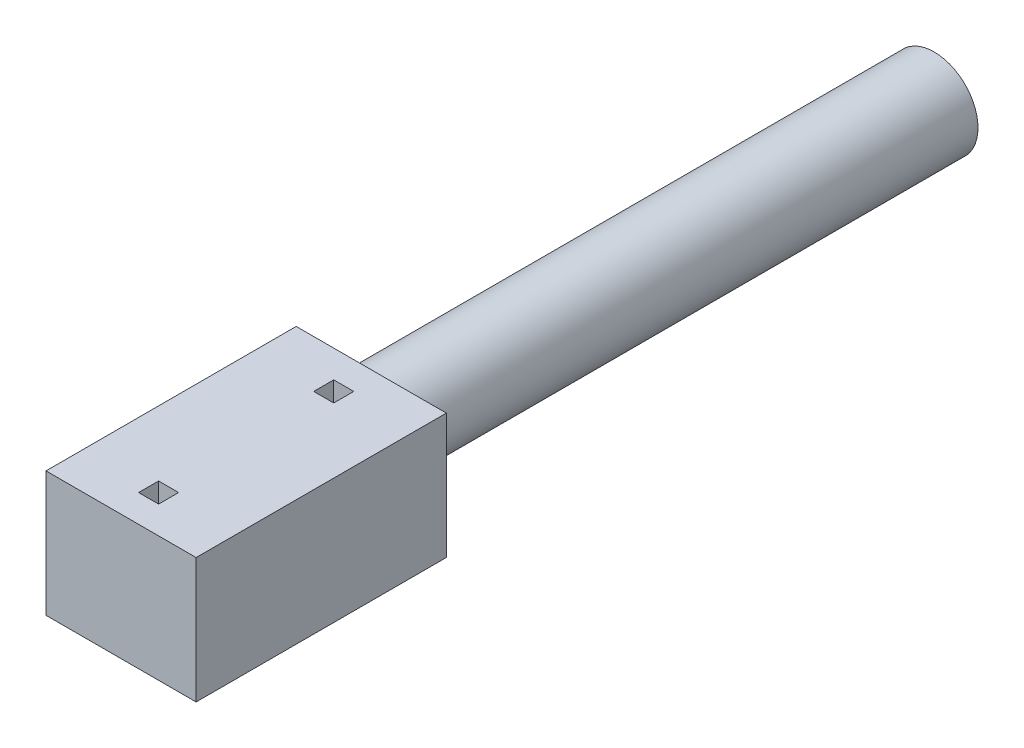
ISO-10303-21;
HEADER;
FILE_DESCRIPTION(('STEP AP214'),'2;1');
FILE_NAME('part.step','',(''),(''),'','','');
FILE_SCHEMA(('AUTOMOTIVE_DESIGN { 1 0 10303 214 1 1 1 1 }'));
ENDSEC;
DATA;
#1=APPLICATION_CONTEXT('core data for automotive mechanical design processes');
#2=APPLICATION_PROTOCOL_DEFINITION('international standard','automotive_design',2000,#1);
#3=PRODUCT_CONTEXT('',#1,'mechanical');
#4=PRODUCT('Part','Part','',(#3));
#5=PRODUCT_RELATED_PRODUCT_CATEGORY('part','',(#4));
#6=PRODUCT_DEFINITION_FORMATION('','',#4);
#7=PRODUCT_DEFINITION_CONTEXT('part definition',#1,'design');
#8=PRODUCT_DEFINITION('design','',#6,#7);
#9=PRODUCT_DEFINITION_SHAPE('','',#8);
#10=(LENGTH_UNIT() NAMED_UNIT(*) SI_UNIT(.MILLI.,.METRE.));
#11=(NAMED_UNIT(*) PLANE_ANGLE_UNIT() SI_UNIT($,.RADIAN.));
#12=(NAMED_UNIT(*) SI_UNIT($,.STERADIAN.) SOLID_ANGLE_UNIT());
#13=UNCERTAINTY_MEASURE_WITH_UNIT(LENGTH_MEASURE(1.E-05),#10,'distance_accuracy_value','');
#14=(GEOMETRIC_REPRESENTATION_CONTEXT(3) GLOBAL_UNCERTAINTY_ASSIGNED_CONTEXT((#13)) GLOBAL_UNIT_ASSIGNED_CONTEXT((#10,
#11,#12)) REPRESENTATION_CONTEXT('',''));
#15=CARTESIAN_POINT('',(0.,0.,0.));
#16=DIRECTION('',(0.,0.,1.));
#17=DIRECTION('',(1.,0.,0.));
#18=AXIS2_PLACEMENT_3D('',#15,#16,#17);
#19=CARTESIAN_POINT('',(-6.,0.,10.));
#20=DIRECTION('',(0.,1.,0.));
#21=DIRECTION('',(0.,0.,1.));
#22=AXIS2_PLACEMENT_3D('',#19,#20,#21);
#23=PLANE('',#22);
#24=DIRECTION('',(-1.,0.,0.));
#25=VECTOR('',#24,1.);
#26=CARTESIAN_POINT('',(-6.,0.,-6.2));
#27=LINE('',#26,#25);
#28=CARTESIAN_POINT('',(0.8,0.,-6.2));
#29=VERTEX_POINT('',#28);
#30=CARTESIAN_POINT('',(-0.8,0.,-6.2));
#31=VERTEX_POINT('',#30);
#32=EDGE_CURVE('E247',#29,#31,#27,.T.);
#33=ORIENTED_EDGE('',*,*,#32,.F.);
#34=DIRECTION('',(0.,0.,1.));
#35=VECTOR('',#34,1.);
#36=CARTESIAN_POINT('',(0.8,0.,10.));
#37=LINE('',#36,#35);
#38=CARTESIAN_POINT('',(0.8,0.,-7.8));
#39=VERTEX_POINT('',#38);
#40=EDGE_CURVE('E245',#39,#29,#37,.T.);
#41=ORIENTED_EDGE('',*,*,#40,.F.);
#42=DIRECTION('',(-1.,0.,0.));
#43=VECTOR('',#42,1.);
#44=CARTESIAN_POINT('',(-6.,0.,-7.8));
#45=LINE('',#44,#43);
#46=CARTESIAN_POINT('',(-0.8,0.,-7.8));
#47=VERTEX_POINT('',#46);
#48=EDGE_CURVE('E249',#39,#47,#45,.T.);
#49=ORIENTED_EDGE('',*,*,#48,.T.);
#50=DIRECTION('',(0.,0.,-1.));
#51=VECTOR('',#50,1.);
#52=CARTESIAN_POINT('',(-0.8,0.,10.));
#53=LINE('',#52,#51);
#54=EDGE_CURVE('E237',#31,#47,#53,.T.);
#55=ORIENTED_EDGE('',*,*,#54,.F.);
#56=EDGE_LOOP('',(#33,#41,#49,#55));
#57=FACE_BOUND('',#56,.T.);
#58=DIRECTION('',(1.,0.,0.));
#59=VECTOR('',#58,1.);
#60=CARTESIAN_POINT('',(-6.,0.,-10.));
#61=LINE('',#60,#59);
#62=CARTESIAN_POINT('',(-6.,0.,-10.));
#63=VERTEX_POINT('',#62);
#64=CARTESIAN_POINT('',(6.,0.,-10.));
#65=VERTEX_POINT('',#64);
#66=EDGE_CURVE('E211',#63,#65,#61,.T.);
#67=ORIENTED_EDGE('',*,*,#66,.T.);
#68=DIRECTION('',(0.,0.,-1.));
#69=VECTOR('',#68,1.);
#70=CARTESIAN_POINT('',(6.,0.,10.));
#71=LINE('',#70,#69);
#72=CARTESIAN_POINT('',(6.,0.,10.));
#73=VERTEX_POINT('',#72);
#74=EDGE_CURVE('E196',#73,#65,#71,.T.);
#75=ORIENTED_EDGE('',*,*,#74,.F.);
#76=DIRECTION('',(1.,0.,0.));
#77=VECTOR('',#76,1.);
#78=CARTESIAN_POINT('',(-6.,0.,10.));
#79=LINE('',#78,#77);
#80=CARTESIAN_POINT('',(-6.,0.,10.));
#81=VERTEX_POINT('',#80);
#82=EDGE_CURVE('E220',#81,#73,#79,.T.);
#83=ORIENTED_EDGE('',*,*,#82,.F.);
#84=DIRECTION('',(0.,0.,-1.));
#85=VECTOR('',#84,1.);
#86=CARTESIAN_POINT('',(-6.,0.,10.));
#87=LINE('',#86,#85);
#88=EDGE_CURVE('E193',#81,#63,#87,.T.);
#89=ORIENTED_EDGE('',*,*,#88,.T.);
#90=EDGE_LOOP('',(#67,#75,#83,#89));
#91=FACE_BOUND('',#90,.T.);
#92=DIRECTION('',(-1.,0.,0.));
#93=VECTOR('',#92,1.);
#94=CARTESIAN_POINT('',(-6.,0.,3.6));
#95=LINE('',#94,#93);
#96=CARTESIAN_POINT('',(3.6,0.,3.6));
#97=VERTEX_POINT('',#96);
#98=CARTESIAN_POINT('',(-3.6,0.,3.6));
#99=VERTEX_POINT('',#98);
#100=EDGE_CURVE('E183',#97,#99,#95,.T.);
#101=ORIENTED_EDGE('',*,*,#100,.F.);
#102=DIRECTION('',(0.,0.,1.));
#103=VECTOR('',#102,1.);
#104=CARTESIAN_POINT('',(3.6,0.,10.));
#105=LINE('',#104,#103);
#106=CARTESIAN_POINT('',(3.6,0.,-3.6));
#107=VERTEX_POINT('',#106);
#108=EDGE_CURVE('E188',#107,#97,#105,.T.);
#109=ORIENTED_EDGE('',*,*,#108,.F.);
#110=DIRECTION('',(-1.,0.,0.));
#111=VECTOR('',#110,1.);
#112=CARTESIAN_POINT('',(-6.,0.,-3.6));
#113=LINE('',#112,#111);
#114=CARTESIAN_POINT('',(-3.6,0.,-3.6));
#115=VERTEX_POINT('',#114);
#116=EDGE_CURVE('E190',#107,#115,#113,.T.);
#117=ORIENTED_EDGE('',*,*,#116,.T.);
#118=DIRECTION('',(0.,0.,-1.));
#119=VECTOR('',#118,1.);
#120=CARTESIAN_POINT('',(-3.6,0.,10.));
#121=LINE('',#120,#119);
#122=EDGE_CURVE('E185',#99,#115,#121,.T.);
#123=ORIENTED_EDGE('',*,*,#122,.F.);
#124=EDGE_LOOP('',(#101,#109,#117,#123));
#125=FACE_BOUND('',#124,.T.);
#126=DIRECTION('',(-1.,0.,0.));
#127=VECTOR('',#126,1.);
#128=CARTESIAN_POINT('',(-6.,0.,7.8));
#129=LINE('',#128,#127);
#130=CARTESIAN_POINT('',(0.8,0.,7.8));
#131=VERTEX_POINT('',#130);
#132=CARTESIAN_POINT('',(-0.8,0.,7.8));
#133=VERTEX_POINT('',#132);
#134=EDGE_CURVE('E265',#131,#133,#129,.T.);
#135=ORIENTED_EDGE('',*,*,#134,.F.);
#136=DIRECTION('',(0.,0.,1.));
#137=VECTOR('',#136,1.);
#138=CARTESIAN_POINT('',(0.8,0.,10.));
#139=LINE('',#138,#137);
#140=CARTESIAN_POINT('',(0.8,0.,6.2));
#141=VERTEX_POINT('',#140);
#142=EDGE_CURVE('E263',#141,#131,#139,.T.);
#143=ORIENTED_EDGE('',*,*,#142,.F.);
#144=DIRECTION('',(-1.,0.,0.));
#145=VECTOR('',#144,1.);
#146=CARTESIAN_POINT('',(-6.,0.,6.2));
#147=LINE('',#146,#145);
#148=CARTESIAN_POINT('',(-0.8,0.,6.2));
#149=VERTEX_POINT('',#148);
#150=EDGE_CURVE('E267',#141,#149,#147,.T.);
#151=ORIENTED_EDGE('',*,*,#150,.T.);
#152=DIRECTION('',(0.,0.,-1.));
#153=VECTOR('',#152,1.);
#154=CARTESIAN_POINT('',(-0.8,0.,10.));
#155=LINE('',#154,#153);
#156=EDGE_CURVE('E166',#133,#149,#155,.T.);
#157=ORIENTED_EDGE('',*,*,#156,.F.);
#158=EDGE_LOOP('',(#135,#143,#151,#157));
#159=FACE_BOUND('',#158,.T.);
#160=ADVANCED_FACE('F43',(#57,#91,#125,#159),#23,.F.);
#161=CARTESIAN_POINT('',(-6.,10.,10.));
#162=DIRECTION('',(0.,-1.,0.));
#163=DIRECTION('',(0.,0.,-1.));
#164=AXIS2_PLACEMENT_3D('',#161,#162,#163);
#165=PLANE('',#164);
#166=DIRECTION('',(1.,0.,0.));
#167=VECTOR('',#166,1.);
#168=CARTESIAN_POINT('',(-6.,10.,-6.2));
#169=LINE('',#168,#167);
#170=CARTESIAN_POINT('',(-0.8,10.,-6.2));
#171=VERTEX_POINT('',#170);
#172=CARTESIAN_POINT('',(0.8,10.,-6.2));
#173=VERTEX_POINT('',#172);
#174=EDGE_CURVE('E159',#171,#173,#169,.T.);
#175=ORIENTED_EDGE('',*,*,#174,.F.);
#176=DIRECTION('',(0.,0.,1.));
#177=VECTOR('',#176,1.);
#178=CARTESIAN_POINT('',(-0.8,10.,10.));
#179=LINE('',#178,#177);
#180=CARTESIAN_POINT('',(-0.8,10.,-7.8));
#181=VERTEX_POINT('',#180);
#182=EDGE_CURVE('E175',#181,#171,#179,.T.);
#183=ORIENTED_EDGE('',*,*,#182,.F.);
#184=DIRECTION('',(1.,0.,0.));
#185=VECTOR('',#184,1.);
#186=CARTESIAN_POINT('',(-6.,10.,-7.8));
#187=LINE('',#186,#185);
#188=CARTESIAN_POINT('',(0.8,10.,-7.8));
#189=VERTEX_POINT('',#188);
#190=EDGE_CURVE('E180',#181,#189,#187,.T.);
#191=ORIENTED_EDGE('',*,*,#190,.T.);
#192=DIRECTION('',(0.,0.,-1.));
#193=VECTOR('',#192,1.);
#194=CARTESIAN_POINT('',(0.8,10.,10.));
#195=LINE('',#194,#193);
#196=EDGE_CURVE('E177',#173,#189,#195,.T.);
#197=ORIENTED_EDGE('',*,*,#196,.F.);
#198=EDGE_LOOP('',(#175,#183,#191,#197));
#199=FACE_BOUND('',#198,.T.);
#200=DIRECTION('',(-1.,0.,0.));
#201=VECTOR('',#200,1.);
#202=CARTESIAN_POINT('',(-6.,10.,-10.));
#203=LINE('',#202,#201);
#204=CARTESIAN_POINT('',(6.,10.,-10.));
#205=VERTEX_POINT('',#204);
#206=CARTESIAN_POINT('',(-6.,10.,-10.));
#207=VERTEX_POINT('',#206);
#208=EDGE_CURVE('E206',#205,#207,#203,.T.);
#209=ORIENTED_EDGE('',*,*,#208,.T.);
#210=DIRECTION('',(0.,0.,-1.));
#211=VECTOR('',#210,1.);
#212=CARTESIAN_POINT('',(-6.,10.,10.));
#213=LINE('',#212,#211);
#214=CARTESIAN_POINT('',(-6.,10.,10.));
#215=VERTEX_POINT('',#214);
#216=EDGE_CURVE('E202',#215,#207,#213,.T.);
#217=ORIENTED_EDGE('',*,*,#216,.F.);
#218=DIRECTION('',(-1.,0.,0.));
#219=VECTOR('',#218,1.);
#220=CARTESIAN_POINT('',(-6.,10.,10.));
#221=LINE('',#220,#219);
#222=CARTESIAN_POINT('',(6.,10.,10.));
#223=VERTEX_POINT('',#222);
#224=EDGE_CURVE('E205',#223,#215,#221,.T.);
#225=ORIENTED_EDGE('',*,*,#224,.F.);
#226=DIRECTION('',(0.,0.,-1.));
#227=VECTOR('',#226,1.);
#228=CARTESIAN_POINT('',(6.,10.,10.));
#229=LINE('',#228,#227);
#230=EDGE_CURVE('E199',#223,#205,#229,.T.);
#231=ORIENTED_EDGE('',*,*,#230,.T.);
#232=EDGE_LOOP('',(#209,#217,#225,#231));
#233=FACE_BOUND('',#232,.T.);
#234=DIRECTION('',(1.,0.,0.));
#235=VECTOR('',#234,1.);
#236=CARTESIAN_POINT('',(-6.,10.,7.8));
#237=LINE('',#236,#235);
#238=CARTESIAN_POINT('',(-0.8,10.,7.8));
#239=VERTEX_POINT('',#238);
#240=CARTESIAN_POINT('',(0.8,10.,7.8));
#241=VERTEX_POINT('',#240);
#242=EDGE_CURVE('E11',#239,#241,#237,.T.);
#243=ORIENTED_EDGE('',*,*,#242,.F.);
#244=DIRECTION('',(0.,0.,1.));
#245=VECTOR('',#244,1.);
#246=CARTESIAN_POINT('',(-0.8,10.,10.));
#247=LINE('',#246,#245);
#248=CARTESIAN_POINT('',(-0.8,10.,6.2));
#249=VERTEX_POINT('',#248);
#250=EDGE_CURVE('E52',#249,#239,#247,.T.);
#251=ORIENTED_EDGE('',*,*,#250,.F.);
#252=DIRECTION('',(1.,0.,0.));
#253=VECTOR('',#252,1.);
#254=CARTESIAN_POINT('',(-6.,10.,6.2));
#255=LINE('',#254,#253);
#256=CARTESIAN_POINT('',(0.8,10.,6.2));
#257=VERTEX_POINT('',#256);
#258=EDGE_CURVE('E153',#249,#257,#255,.T.);
#259=ORIENTED_EDGE('',*,*,#258,.T.);
#260=DIRECTION('',(0.,0.,-1.));
#261=VECTOR('',#260,1.);
#262=CARTESIAN_POINT('',(0.8,10.,10.));
#263=LINE('',#262,#261);
#264=EDGE_CURVE('E158',#241,#257,#263,.T.);
#265=ORIENTED_EDGE('',*,*,#264,.F.);
#266=EDGE_LOOP('',(#243,#251,#259,#265));
#267=FACE_BOUND('',#266,.T.);
#268=ADVANCED_FACE('F170',(#199,#233,#267),#165,.F.);
#269=CARTESIAN_POINT('',(-6.,0.,10.));
#270=DIRECTION('',(1.,0.,0.));
#271=DIRECTION('',(0.,0.,-1.));
#272=AXIS2_PLACEMENT_3D('',#269,#270,#271);
#273=PLANE('',#272);
#274=DIRECTION('',(0.,-1.,0.));
#275=VECTOR('',#274,1.);
#276=CARTESIAN_POINT('',(-6.,0.,-10.));
#277=LINE('',#276,#275);
#278=EDGE_CURVE('E213',#207,#63,#277,.T.);
#279=ORIENTED_EDGE('',*,*,#278,.T.);
#280=ORIENTED_EDGE('',*,*,#88,.F.);
#281=DIRECTION('',(0.,-1.,0.));
#282=VECTOR('',#281,1.);
#283=CARTESIAN_POINT('',(-6.,0.,10.));
#284=LINE('',#283,#282);
#285=EDGE_CURVE('E208',#215,#81,#284,.T.);
#286=ORIENTED_EDGE('',*,*,#285,.F.);
#287=ORIENTED_EDGE('',*,*,#216,.T.);
#288=EDGE_LOOP('',(#279,#280,#286,#287));
#289=FACE_BOUND('',#288,.T.);
#290=ADVANCED_FACE('F45',(#289),#273,.F.);
#291=CARTESIAN_POINT('',(6.,0.,10.));
#292=DIRECTION('',(-1.,0.,0.));
#293=DIRECTION('',(0.,0.,1.));
#294=AXIS2_PLACEMENT_3D('',#291,#292,#293);
#295=PLANE('',#294);
#296=DIRECTION('',(0.,1.,0.));
#297=VECTOR('',#296,1.);
#298=CARTESIAN_POINT('',(6.,0.,-10.));
#299=LINE('',#298,#297);
#300=EDGE_CURVE('E209',#65,#205,#299,.T.);
#301=ORIENTED_EDGE('',*,*,#300,.T.);
#302=ORIENTED_EDGE('',*,*,#230,.F.);
#303=DIRECTION('',(0.,1.,0.));
#304=VECTOR('',#303,1.);
#305=CARTESIAN_POINT('',(6.,0.,10.));
#306=LINE('',#305,#304);
#307=EDGE_CURVE('E218',#73,#223,#306,.T.);
#308=ORIENTED_EDGE('',*,*,#307,.F.);
#309=ORIENTED_EDGE('',*,*,#74,.T.);
#310=EDGE_LOOP('',(#301,#302,#308,#309));
#311=FACE_BOUND('',#310,.T.);
#312=ADVANCED_FACE('F309',(#311),#295,.F.);
#313=CARTESIAN_POINT('',(0.,0.,10.));
#314=DIRECTION('',(0.,0.,-1.));
#315=DIRECTION('',(-1.,0.,0.));
#316=AXIS2_PLACEMENT_3D('',#313,#314,#315);
#317=PLANE('',#316);
#318=ORIENTED_EDGE('',*,*,#285,.T.);
#319=ORIENTED_EDGE('',*,*,#82,.T.);
#320=ORIENTED_EDGE('',*,*,#307,.T.);
#321=ORIENTED_EDGE('',*,*,#224,.T.);
#322=EDGE_LOOP('',(#318,#319,#320,#321));
#323=FACE_BOUND('',#322,.T.);
#324=ADVANCED_FACE('F311',(#323),#317,.F.);
#325=CARTESIAN_POINT('',(0.,0.,-10.));
#326=DIRECTION('',(0.,0.,-1.));
#327=DIRECTION('',(-1.,0.,0.));
#328=AXIS2_PLACEMENT_3D('',#325,#326,#327);
#329=PLANE('',#328);
#330=CARTESIAN_POINT('',(0.,6.,-10.));
#331=DIRECTION('',(0.,0.,-1.));
#332=DIRECTION('',(-1.,0.,0.));
#333=AXIS2_PLACEMENT_3D('',#330,#331,#332);
#334=CIRCLE('',#333,3.5);
#335=CARTESIAN_POINT('',(-3.5,6.,-10.));
#336=VERTEX_POINT('',#335);
#337=EDGE_CURVE('E47',#336,#336,#334,.F.);
#338=ORIENTED_EDGE('',*,*,#337,.T.);
#339=EDGE_LOOP('',(#338));
#340=FACE_BOUND('',#339,.T.);
#341=ORIENTED_EDGE('',*,*,#278,.F.);
#342=ORIENTED_EDGE('',*,*,#208,.F.);
#343=ORIENTED_EDGE('',*,*,#300,.F.);
#344=ORIENTED_EDGE('',*,*,#66,.F.);
#345=EDGE_LOOP('',(#341,#342,#343,#344));
#346=FACE_BOUND('',#345,.T.);
#347=ADVANCED_FACE('F282',(#340,#346),#329,.T.);
#348=CARTESIAN_POINT('',(-3.6,-1.,3.6));
#349=DIRECTION('',(1.,0.,0.));
#350=DIRECTION('',(0.,0.,-1.));
#351=AXIS2_PLACEMENT_3D('',#348,#349,#350);
#352=PLANE('',#351);
#353=ORIENTED_EDGE('',*,*,#122,.T.);
#354=DIRECTION('',(0.,-1.,0.));
#355=VECTOR('',#354,1.);
#356=CARTESIAN_POINT('',(-3.6,-1.,-3.6));
#357=LINE('',#356,#355);
#358=CARTESIAN_POINT('',(-3.6,4.,-3.6));
#359=VERTEX_POINT('',#358);
#360=EDGE_CURVE('E235',#359,#115,#357,.T.);
#361=ORIENTED_EDGE('',*,*,#360,.F.);
#362=DIRECTION('',(0.,0.,-1.));
#363=VECTOR('',#362,1.);
#364=CARTESIAN_POINT('',(-3.6,4.,3.6));
#365=LINE('',#364,#363);
#366=CARTESIAN_POINT('',(-3.6,4.,3.6));
#367=VERTEX_POINT('',#366);
#368=EDGE_CURVE('E226',#367,#359,#365,.T.);
#369=ORIENTED_EDGE('',*,*,#368,.F.);
#370=DIRECTION('',(0.,-1.,0.));
#371=VECTOR('',#370,1.);
#372=CARTESIAN_POINT('',(-3.6,-1.,3.6));
#373=LINE('',#372,#371);
#374=EDGE_CURVE('E232',#367,#99,#373,.T.);
#375=ORIENTED_EDGE('',*,*,#374,.T.);
#376=EDGE_LOOP('',(#353,#361,#369,#375));
#377=FACE_BOUND('',#376,.T.);
#378=ADVANCED_FACE('F315',(#377),#352,.T.);
#379=CARTESIAN_POINT('',(3.6,-1.,3.6));
#380=DIRECTION('',(-1.,0.,0.));
#381=DIRECTION('',(0.,0.,1.));
#382=AXIS2_PLACEMENT_3D('',#379,#380,#381);
#383=PLANE('',#382);
#384=ORIENTED_EDGE('',*,*,#108,.T.);
#385=DIRECTION('',(0.,1.,0.));
#386=VECTOR('',#385,1.);
#387=CARTESIAN_POINT('',(3.6,-1.,3.6));
#388=LINE('',#387,#386);
#389=CARTESIAN_POINT('',(3.6,4.,3.6));
#390=VERTEX_POINT('',#389);
#391=EDGE_CURVE('E239',#97,#390,#388,.T.);
#392=ORIENTED_EDGE('',*,*,#391,.T.);
#393=DIRECTION('',(0.,0.,-1.));
#394=VECTOR('',#393,1.);
#395=CARTESIAN_POINT('',(3.6,4.,3.6));
#396=LINE('',#395,#394);
#397=CARTESIAN_POINT('',(3.6,4.,-3.6));
#398=VERTEX_POINT('',#397);
#399=EDGE_CURVE('E216',#390,#398,#396,.T.);
#400=ORIENTED_EDGE('',*,*,#399,.T.);
#401=DIRECTION('',(0.,1.,0.));
#402=VECTOR('',#401,1.);
#403=CARTESIAN_POINT('',(3.6,-1.,-3.6));
#404=LINE('',#403,#402);
#405=EDGE_CURVE('E233',#107,#398,#404,.T.);
#406=ORIENTED_EDGE('',*,*,#405,.F.);
#407=EDGE_LOOP('',(#384,#392,#400,#406));
#408=FACE_BOUND('',#407,.T.);
#409=ADVANCED_FACE('F321',(#408),#383,.T.);
#410=CARTESIAN_POINT('',(0.,0.,3.6));
#411=DIRECTION('',(0.,0.,-1.));
#412=DIRECTION('',(-1.,0.,0.));
#413=AXIS2_PLACEMENT_3D('',#410,#411,#412);
#414=PLANE('',#413);
#415=ORIENTED_EDGE('',*,*,#100,.T.);
#416=ORIENTED_EDGE('',*,*,#374,.F.);
#417=DIRECTION('',(-1.,0.,0.));
#418=VECTOR('',#417,1.);
#419=CARTESIAN_POINT('',(-3.6,4.,3.6));
#420=LINE('',#419,#418);
#421=EDGE_CURVE('E229',#390,#367,#420,.T.);
#422=ORIENTED_EDGE('',*,*,#421,.F.);
#423=ORIENTED_EDGE('',*,*,#391,.F.);
#424=EDGE_LOOP('',(#415,#416,#422,#423));
#425=FACE_BOUND('',#424,.T.);
#426=ADVANCED_FACE('F325',(#425),#414,.T.);
#427=CARTESIAN_POINT('',(0.,0.,-3.6));
#428=DIRECTION('',(0.,0.,-1.));
#429=DIRECTION('',(-1.,0.,0.));
#430=AXIS2_PLACEMENT_3D('',#427,#428,#429);
#431=PLANE('',#430);
#432=ORIENTED_EDGE('',*,*,#405,.T.);
#433=DIRECTION('',(-1.,0.,0.));
#434=VECTOR('',#433,1.);
#435=CARTESIAN_POINT('',(-3.6,4.,-3.6));
#436=LINE('',#435,#434);
#437=EDGE_CURVE('E230',#398,#359,#436,.T.);
#438=ORIENTED_EDGE('',*,*,#437,.T.);
#439=ORIENTED_EDGE('',*,*,#360,.T.);
#440=ORIENTED_EDGE('',*,*,#116,.F.);
#441=EDGE_LOOP('',(#432,#438,#439,#440));
#442=FACE_BOUND('',#441,.T.);
#443=ADVANCED_FACE('F331',(#442),#431,.F.);
#444=CARTESIAN_POINT('',(-3.6,4.,3.6));
#445=DIRECTION('',(0.,-1.,0.));
#446=DIRECTION('',(0.,0.,-1.));
#447=AXIS2_PLACEMENT_3D('',#444,#445,#446);
#448=PLANE('',#447);
#449=ORIENTED_EDGE('',*,*,#437,.F.);
#450=ORIENTED_EDGE('',*,*,#399,.F.);
#451=ORIENTED_EDGE('',*,*,#421,.T.);
#452=ORIENTED_EDGE('',*,*,#368,.T.);
#453=EDGE_LOOP('',(#449,#450,#451,#452));
#454=FACE_BOUND('',#453,.T.);
#455=ADVANCED_FACE('F327',(#454),#448,.T.);
#456=CARTESIAN_POINT('',(-0.8,-1.,-6.2));
#457=DIRECTION('',(1.,0.,0.));
#458=DIRECTION('',(0.,0.,-1.));
#459=AXIS2_PLACEMENT_3D('',#456,#457,#458);
#460=PLANE('',#459);
#461=ORIENTED_EDGE('',*,*,#54,.T.);
#462=DIRECTION('',(0.,-1.,0.));
#463=VECTOR('',#462,1.);
#464=CARTESIAN_POINT('',(-0.8,-1.,-7.8));
#465=LINE('',#464,#463);
#466=EDGE_CURVE('E256',#181,#47,#465,.T.);
#467=ORIENTED_EDGE('',*,*,#466,.F.);
#468=ORIENTED_EDGE('',*,*,#182,.T.);
#469=DIRECTION('',(0.,-1.,0.));
#470=VECTOR('',#469,1.);
#471=CARTESIAN_POINT('',(-0.8,-1.,-6.2));
#472=LINE('',#471,#470);
#473=EDGE_CURVE('E255',#171,#31,#472,.T.);
#474=ORIENTED_EDGE('',*,*,#473,.T.);
#475=EDGE_LOOP('',(#461,#467,#468,#474));
#476=FACE_BOUND('',#475,.T.);
#477=ADVANCED_FACE('F330',(#476),#460,.T.);
#478=CARTESIAN_POINT('',(0.8,-1.,-6.2));
#479=DIRECTION('',(-1.,0.,0.));
#480=DIRECTION('',(0.,0.,1.));
#481=AXIS2_PLACEMENT_3D('',#478,#479,#480);
#482=PLANE('',#481);
#483=ORIENTED_EDGE('',*,*,#40,.T.);
#484=DIRECTION('',(0.,1.,0.));
#485=VECTOR('',#484,1.);
#486=CARTESIAN_POINT('',(0.8,-1.,-6.2));
#487=LINE('',#486,#485);
#488=EDGE_CURVE('E252',#29,#173,#487,.T.);
#489=ORIENTED_EDGE('',*,*,#488,.T.);
#490=ORIENTED_EDGE('',*,*,#196,.T.);
#491=DIRECTION('',(0.,1.,0.));
#492=VECTOR('',#491,1.);
#493=CARTESIAN_POINT('',(0.8,-1.,-7.8));
#494=LINE('',#493,#492);
#495=EDGE_CURVE('E253',#39,#189,#494,.T.);
#496=ORIENTED_EDGE('',*,*,#495,.F.);
#497=EDGE_LOOP('',(#483,#489,#490,#496));
#498=FACE_BOUND('',#497,.T.);
#499=ADVANCED_FACE('F341',(#498),#482,.T.);
#500=CARTESIAN_POINT('',(0.,0.,-6.2));
#501=DIRECTION('',(0.,0.,-1.));
#502=DIRECTION('',(-1.,0.,0.));
#503=AXIS2_PLACEMENT_3D('',#500,#501,#502);
#504=PLANE('',#503);
#505=ORIENTED_EDGE('',*,*,#32,.T.);
#506=ORIENTED_EDGE('',*,*,#473,.F.);
#507=ORIENTED_EDGE('',*,*,#174,.T.);
#508=ORIENTED_EDGE('',*,*,#488,.F.);
#509=EDGE_LOOP('',(#505,#506,#507,#508));
#510=FACE_BOUND('',#509,.T.);
#511=ADVANCED_FACE('F345',(#510),#504,.T.);
#512=CARTESIAN_POINT('',(0.,0.,-7.8));
#513=DIRECTION('',(0.,0.,-1.));
#514=DIRECTION('',(-1.,0.,0.));
#515=AXIS2_PLACEMENT_3D('',#512,#513,#514);
#516=PLANE('',#515);
#517=ORIENTED_EDGE('',*,*,#495,.T.);
#518=ORIENTED_EDGE('',*,*,#190,.F.);
#519=ORIENTED_EDGE('',*,*,#466,.T.);
#520=ORIENTED_EDGE('',*,*,#48,.F.);
#521=EDGE_LOOP('',(#517,#518,#519,#520));
#522=FACE_BOUND('',#521,.T.);
#523=ADVANCED_FACE('F347',(#522),#516,.F.);
#524=CARTESIAN_POINT('',(-0.8,-1.,7.8));
#525=DIRECTION('',(1.,0.,0.));
#526=DIRECTION('',(0.,0.,-1.));
#527=AXIS2_PLACEMENT_3D('',#524,#525,#526);
#528=PLANE('',#527);
#529=ORIENTED_EDGE('',*,*,#156,.T.);
#530=DIRECTION('',(0.,-1.,0.));
#531=VECTOR('',#530,1.);
#532=CARTESIAN_POINT('',(-0.8,-1.,6.2));
#533=LINE('',#532,#531);
#534=EDGE_CURVE('E59',#249,#149,#533,.T.);
#535=ORIENTED_EDGE('',*,*,#534,.F.);
#536=ORIENTED_EDGE('',*,*,#250,.T.);
#537=DIRECTION('',(0.,-1.,0.));
#538=VECTOR('',#537,1.);
#539=CARTESIAN_POINT('',(-0.8,-1.,7.8));
#540=LINE('',#539,#538);
#541=EDGE_CURVE('E270',#239,#133,#540,.T.);
#542=ORIENTED_EDGE('',*,*,#541,.T.);
#543=EDGE_LOOP('',(#529,#535,#536,#542));
#544=FACE_BOUND('',#543,.T.);
#545=ADVANCED_FACE('F162',(#544),#528,.T.);
#546=CARTESIAN_POINT('',(0.8,-1.,7.8));
#547=DIRECTION('',(-1.,0.,0.));
#548=DIRECTION('',(0.,0.,1.));
#549=AXIS2_PLACEMENT_3D('',#546,#547,#548);
#550=PLANE('',#549);
#551=ORIENTED_EDGE('',*,*,#142,.T.);
#552=DIRECTION('',(0.,1.,0.));
#553=VECTOR('',#552,1.);
#554=CARTESIAN_POINT('',(0.8,-1.,7.8));
#555=LINE('',#554,#553);
#556=EDGE_CURVE('E269',#131,#241,#555,.T.);
#557=ORIENTED_EDGE('',*,*,#556,.T.);
#558=ORIENTED_EDGE('',*,*,#264,.T.);
#559=DIRECTION('',(0.,1.,0.));
#560=VECTOR('',#559,1.);
#561=CARTESIAN_POINT('',(0.8,-1.,6.2));
#562=LINE('',#561,#560);
#563=EDGE_CURVE('E64',#141,#257,#562,.T.);
#564=ORIENTED_EDGE('',*,*,#563,.F.);
#565=EDGE_LOOP('',(#551,#557,#558,#564));
#566=FACE_BOUND('',#565,.T.);
#567=ADVANCED_FACE('F356',(#566),#550,.T.);
#568=CARTESIAN_POINT('',(0.,0.,7.8));
#569=DIRECTION('',(0.,0.,-1.));
#570=DIRECTION('',(-1.,0.,0.));
#571=AXIS2_PLACEMENT_3D('',#568,#569,#570);
#572=PLANE('',#571);
#573=ORIENTED_EDGE('',*,*,#134,.T.);
#574=ORIENTED_EDGE('',*,*,#541,.F.);
#575=ORIENTED_EDGE('',*,*,#242,.T.);
#576=ORIENTED_EDGE('',*,*,#556,.F.);
#577=EDGE_LOOP('',(#573,#574,#575,#576));
#578=FACE_BOUND('',#577,.T.);
#579=ADVANCED_FACE('F296',(#578),#572,.T.);
#580=CARTESIAN_POINT('',(0.,0.,6.2));
#581=DIRECTION('',(0.,0.,-1.));
#582=DIRECTION('',(-1.,0.,0.));
#583=AXIS2_PLACEMENT_3D('',#580,#581,#582);
#584=PLANE('',#583);
#585=ORIENTED_EDGE('',*,*,#563,.T.);
#586=ORIENTED_EDGE('',*,*,#258,.F.);
#587=ORIENTED_EDGE('',*,*,#534,.T.);
#588=ORIENTED_EDGE('',*,*,#150,.F.);
#589=EDGE_LOOP('',(#585,#586,#587,#588));
#590=FACE_BOUND('',#589,.T.);
#591=ADVANCED_FACE('F154',(#590),#584,.F.);
#592=CARTESIAN_POINT('',(0.,6.,-9.));
#593=DIRECTION('',(0.,0.,-1.));
#594=DIRECTION('',(-1.,0.,0.));
#595=AXIS2_PLACEMENT_3D('',#592,#593,#594);
#596=CYLINDRICAL_SURFACE('',#595,3.5);
#597=ORIENTED_EDGE('',*,*,#337,.F.);
#598=EDGE_LOOP('',(#597));
#599=FACE_BOUND('',#598,.T.);
#600=CARTESIAN_POINT('',(0.,6.,-55.));
#601=DIRECTION('',(0.,0.,1.));
#602=DIRECTION('',(1.,0.,0.));
#603=AXIS2_PLACEMENT_3D('',#600,#601,#602);
#604=CIRCLE('',#603,3.5);
#605=CARTESIAN_POINT('',(3.5,6.,-55.));
#606=VERTEX_POINT('',#605);
#607=EDGE_CURVE('E275',#606,#606,#604,.T.);
#608=ORIENTED_EDGE('',*,*,#607,.T.);
#609=EDGE_LOOP('',(#608));
#610=FACE_BOUND('',#609,.T.);
#611=ADVANCED_FACE('F285',(#599,#610),#596,.T.);
#612=CARTESIAN_POINT('',(0.,6.,-55.));
#613=DIRECTION('',(0.,0.,1.));
#614=DIRECTION('',(1.,0.,0.));
#615=AXIS2_PLACEMENT_3D('',#612,#613,#614);
#616=PLANE('',#615);
#617=ORIENTED_EDGE('',*,*,#607,.F.);
#618=EDGE_LOOP('',(#617));
#619=FACE_BOUND('',#618,.T.);
#620=ADVANCED_FACE('F287',(#619),#616,.F.);
#621=CLOSED_SHELL('',(#160,#268,#290,#312,#324,#347,#378,#409,#426,#443,#455,#477,#499,#511,
#523,#545,#567,#579,#591,#611,#620));
#622=MANIFOLD_SOLID_BREP('B2',#621);
#623=ADVANCED_BREP_SHAPE_REPRESENTATION('',(#18,#622),#14);
#624=SHAPE_DEFINITION_REPRESENTATION(#9,#623);
ENDSEC;
END-ISO-10303-21;
